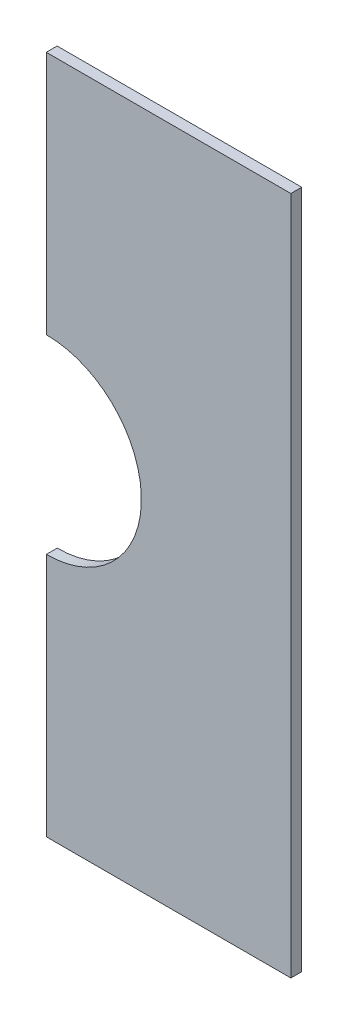
ISO-10303-21;
HEADER;
FILE_DESCRIPTION(('STEP AP214'),'2;1');
FILE_NAME('part.step','',(''),(''),'','','');
FILE_SCHEMA(('AUTOMOTIVE_DESIGN { 1 0 10303 214 1 1 1 1 }'));
ENDSEC;
DATA;
#1=APPLICATION_CONTEXT('core data for automotive mechanical design processes');
#2=APPLICATION_PROTOCOL_DEFINITION('international standard','automotive_design',2000,#1);
#3=PRODUCT_CONTEXT('',#1,'mechanical');
#4=PRODUCT('Part','Part','',(#3));
#5=PRODUCT_RELATED_PRODUCT_CATEGORY('part','',(#4));
#6=PRODUCT_DEFINITION_FORMATION('','',#4);
#7=PRODUCT_DEFINITION_CONTEXT('part definition',#1,'design');
#8=PRODUCT_DEFINITION('design','',#6,#7);
#9=PRODUCT_DEFINITION_SHAPE('','',#8);
#10=(LENGTH_UNIT() NAMED_UNIT(*) SI_UNIT(.MILLI.,.METRE.));
#11=(NAMED_UNIT(*) PLANE_ANGLE_UNIT() SI_UNIT($,.RADIAN.));
#12=(NAMED_UNIT(*) SI_UNIT($,.STERADIAN.) SOLID_ANGLE_UNIT());
#13=UNCERTAINTY_MEASURE_WITH_UNIT(LENGTH_MEASURE(1.E-05),#10,'distance_accuracy_value','');
#14=(GEOMETRIC_REPRESENTATION_CONTEXT(3) GLOBAL_UNCERTAINTY_ASSIGNED_CONTEXT((#13)) GLOBAL_UNIT_ASSIGNED_CONTEXT((#10,
#11,#12)) REPRESENTATION_CONTEXT('',''));
#15=CARTESIAN_POINT('',(0.,0.,0.));
#16=DIRECTION('',(0.,0.,1.));
#17=DIRECTION('',(1.,0.,0.));
#18=AXIS2_PLACEMENT_3D('',#15,#16,#17);
#19=CARTESIAN_POINT('',(-0.55,0.,0.3));
#20=DIRECTION('',(1.,0.,0.));
#21=DIRECTION('',(0.,1.,0.));
#22=AXIS2_PLACEMENT_3D('',#19,#20,#21);
#23=PLANE('',#22);
#24=DIRECTION('',(0.,-1.,0.));
#25=VECTOR('',#24,1.);
#26=CARTESIAN_POINT('',(-0.55,0.,0.28));
#27=LINE('',#26,#25);
#28=CARTESIAN_POINT('',(-0.55,0.625,0.28));
#29=VERTEX_POINT('',#28);
#30=CARTESIAN_POINT('',(-0.55,-0.625,0.28));
#31=VERTEX_POINT('',#30);
#32=EDGE_CURVE('E40',#29,#31,#27,.T.);
#33=ORIENTED_EDGE('',*,*,#32,.F.);
#34=DIRECTION('',(0.,0.,-1.));
#35=VECTOR('',#34,1.);
#36=CARTESIAN_POINT('',(-0.55,0.625,0.3));
#37=LINE('',#36,#35);
#38=CARTESIAN_POINT('',(-0.55,0.625,0.3));
#39=VERTEX_POINT('',#38);
#40=EDGE_CURVE('E48',#39,#29,#37,.T.);
#41=ORIENTED_EDGE('',*,*,#40,.F.);
#42=DIRECTION('',(0.,-1.,0.));
#43=VECTOR('',#42,1.);
#44=CARTESIAN_POINT('',(-0.55,0.,0.3));
#45=LINE('',#44,#43);
#46=CARTESIAN_POINT('',(-0.55,-0.625,0.3));
#47=VERTEX_POINT('',#46);
#48=EDGE_CURVE('E11',#39,#47,#45,.T.);
#49=ORIENTED_EDGE('',*,*,#48,.T.);
#50=DIRECTION('',(0.,0.,-1.));
#51=VECTOR('',#50,1.);
#52=CARTESIAN_POINT('',(-0.55,-0.625,0.3));
#53=LINE('',#52,#51);
#54=EDGE_CURVE('E27',#47,#31,#53,.T.);
#55=ORIENTED_EDGE('',*,*,#54,.T.);
#56=EDGE_LOOP('',(#33,#41,#49,#55));
#57=FACE_BOUND('',#56,.T.);
#58=ADVANCED_FACE('F17',(#57),#23,.T.);
#59=CARTESIAN_POINT('',(-0.775,0.625,0.3));
#60=DIRECTION('',(0.,-1.,0.));
#61=DIRECTION('',(0.,0.,-1.));
#62=AXIS2_PLACEMENT_3D('',#59,#60,#61);
#63=PLANE('',#62);
#64=DIRECTION('',(-1.,0.,0.));
#65=VECTOR('',#64,1.);
#66=CARTESIAN_POINT('',(-0.775,0.625,0.28));
#67=LINE('',#66,#65);
#68=CARTESIAN_POINT('',(-1.,0.625,0.28));
#69=VERTEX_POINT('',#68);
#70=EDGE_CURVE('E138',#29,#69,#67,.T.);
#71=ORIENTED_EDGE('',*,*,#70,.T.);
#72=DIRECTION('',(0.,0.,-1.));
#73=VECTOR('',#72,1.);
#74=CARTESIAN_POINT('',(-1.,0.625,0.3));
#75=LINE('',#74,#73);
#76=CARTESIAN_POINT('',(-1.,0.625,0.3));
#77=VERTEX_POINT('',#76);
#78=EDGE_CURVE('E135',#77,#69,#75,.T.);
#79=ORIENTED_EDGE('',*,*,#78,.F.);
#80=DIRECTION('',(-1.,0.,0.));
#81=VECTOR('',#80,1.);
#82=CARTESIAN_POINT('',(-0.775,0.625,0.3));
#83=LINE('',#82,#81);
#84=EDGE_CURVE('E150',#39,#77,#83,.T.);
#85=ORIENTED_EDGE('',*,*,#84,.F.);
#86=ORIENTED_EDGE('',*,*,#40,.T.);
#87=EDGE_LOOP('',(#71,#79,#85,#86));
#88=FACE_BOUND('',#87,.T.);
#89=ADVANCED_FACE('F211',(#88),#63,.F.);
#90=CARTESIAN_POINT('',(-1.,0.4,0.3));
#91=DIRECTION('',(1.,0.,0.));
#92=DIRECTION('',(0.,1.,0.));
#93=AXIS2_PLACEMENT_3D('',#90,#91,#92);
#94=PLANE('',#93);
#95=DIRECTION('',(0.,-1.,0.));
#96=VECTOR('',#95,1.);
#97=CARTESIAN_POINT('',(-1.,0.4,0.28));
#98=LINE('',#97,#96);
#99=CARTESIAN_POINT('',(-1.,0.175,0.28));
#100=VERTEX_POINT('',#99);
#101=EDGE_CURVE('E132',#69,#100,#98,.T.);
#102=ORIENTED_EDGE('',*,*,#101,.T.);
#103=DIRECTION('',(0.,0.,-1.));
#104=VECTOR('',#103,1.);
#105=CARTESIAN_POINT('',(-1.,0.175,0.3));
#106=LINE('',#105,#104);
#107=CARTESIAN_POINT('',(-1.,0.175,0.3));
#108=VERTEX_POINT('',#107);
#109=EDGE_CURVE('E107',#108,#100,#106,.T.);
#110=ORIENTED_EDGE('',*,*,#109,.F.);
#111=DIRECTION('',(0.,-1.,0.));
#112=VECTOR('',#111,1.);
#113=CARTESIAN_POINT('',(-1.,0.4,0.3));
#114=LINE('',#113,#112);
#115=EDGE_CURVE('E145',#77,#108,#114,.T.);
#116=ORIENTED_EDGE('',*,*,#115,.F.);
#117=ORIENTED_EDGE('',*,*,#78,.T.);
#118=EDGE_LOOP('',(#102,#110,#116,#117));
#119=FACE_BOUND('',#118,.T.);
#120=ADVANCED_FACE('F216',(#119),#94,.F.);
#121=CARTESIAN_POINT('',(-1.,0.,0.3));
#122=DIRECTION('',(0.,0.,-1.));
#123=DIRECTION('',(1.,0.,0.));
#124=AXIS2_PLACEMENT_3D('',#121,#122,#123);
#125=CYLINDRICAL_SURFACE('',#124,0.175);
#126=CARTESIAN_POINT('',(-1.,0.,0.28));
#127=DIRECTION('',(0.,0.,1.));
#128=DIRECTION('',(1.,0.,0.));
#129=AXIS2_PLACEMENT_3D('',#126,#127,#128);
#130=CIRCLE('',#129,0.175);
#131=CARTESIAN_POINT('',(-1.,-0.175,0.28));
#132=VERTEX_POINT('',#131);
#133=EDGE_CURVE('E104',#132,#100,#130,.T.);
#134=ORIENTED_EDGE('',*,*,#133,.F.);
#135=DIRECTION('',(0.,0.,-1.));
#136=VECTOR('',#135,1.);
#137=CARTESIAN_POINT('',(-1.,-0.175,0.3));
#138=LINE('',#137,#136);
#139=CARTESIAN_POINT('',(-1.,-0.175,0.3));
#140=VERTEX_POINT('',#139);
#141=EDGE_CURVE('E101',#140,#132,#138,.T.);
#142=ORIENTED_EDGE('',*,*,#141,.F.);
#143=CARTESIAN_POINT('',(-1.,0.,0.3));
#144=DIRECTION('',(0.,0.,1.));
#145=DIRECTION('',(1.,0.,0.));
#146=AXIS2_PLACEMENT_3D('',#143,#144,#145);
#147=CIRCLE('',#146,0.175);
#148=EDGE_CURVE('E128',#140,#108,#147,.T.);
#149=ORIENTED_EDGE('',*,*,#148,.T.);
#150=ORIENTED_EDGE('',*,*,#109,.T.);
#151=EDGE_LOOP('',(#134,#142,#149,#150));
#152=FACE_BOUND('',#151,.T.);
#153=ADVANCED_FACE('F105',(#152),#125,.F.);
#154=CARTESIAN_POINT('',(-1.,-0.4,0.3));
#155=DIRECTION('',(1.,0.,0.));
#156=DIRECTION('',(0.,1.,0.));
#157=AXIS2_PLACEMENT_3D('',#154,#155,#156);
#158=PLANE('',#157);
#159=DIRECTION('',(0.,-1.,0.));
#160=VECTOR('',#159,1.);
#161=CARTESIAN_POINT('',(-1.,-0.4,0.28));
#162=LINE('',#161,#160);
#163=CARTESIAN_POINT('',(-1.,-0.625,0.28));
#164=VERTEX_POINT('',#163);
#165=EDGE_CURVE('E116',#132,#164,#162,.T.);
#166=ORIENTED_EDGE('',*,*,#165,.T.);
#167=DIRECTION('',(0.,0.,-1.));
#168=VECTOR('',#167,1.);
#169=CARTESIAN_POINT('',(-1.,-0.625,0.3));
#170=LINE('',#169,#168);
#171=CARTESIAN_POINT('',(-1.,-0.625,0.3));
#172=VERTEX_POINT('',#171);
#173=EDGE_CURVE('E92',#172,#164,#170,.T.);
#174=ORIENTED_EDGE('',*,*,#173,.F.);
#175=DIRECTION('',(0.,-1.,0.));
#176=VECTOR('',#175,1.);
#177=CARTESIAN_POINT('',(-1.,-0.4,0.3));
#178=LINE('',#177,#176);
#179=EDGE_CURVE('E82',#140,#172,#178,.T.);
#180=ORIENTED_EDGE('',*,*,#179,.F.);
#181=ORIENTED_EDGE('',*,*,#141,.T.);
#182=EDGE_LOOP('',(#166,#174,#180,#181));
#183=FACE_BOUND('',#182,.T.);
#184=ADVANCED_FACE('F115',(#183),#158,.F.);
#185=CARTESIAN_POINT('',(-0.775,-0.625,0.3));
#186=DIRECTION('',(0.,-1.,0.));
#187=DIRECTION('',(0.,0.,-1.));
#188=AXIS2_PLACEMENT_3D('',#185,#186,#187);
#189=PLANE('',#188);
#190=DIRECTION('',(-1.,0.,0.));
#191=VECTOR('',#190,1.);
#192=CARTESIAN_POINT('',(-0.775,-0.625,0.28));
#193=LINE('',#192,#191);
#194=EDGE_CURVE('E21',#31,#164,#193,.T.);
#195=ORIENTED_EDGE('',*,*,#194,.F.);
#196=ORIENTED_EDGE('',*,*,#54,.F.);
#197=DIRECTION('',(-1.,0.,0.));
#198=VECTOR('',#197,1.);
#199=CARTESIAN_POINT('',(-0.775,-0.625,0.3));
#200=LINE('',#199,#198);
#201=EDGE_CURVE('E119',#47,#172,#200,.T.);
#202=ORIENTED_EDGE('',*,*,#201,.T.);
#203=ORIENTED_EDGE('',*,*,#173,.T.);
#204=EDGE_LOOP('',(#195,#196,#202,#203));
#205=FACE_BOUND('',#204,.T.);
#206=ADVANCED_FACE('F227',(#205),#189,.T.);
#207=CARTESIAN_POINT('',(0.,0.,0.3));
#208=DIRECTION('',(0.,0.,1.));
#209=DIRECTION('',(1.,0.,0.));
#210=AXIS2_PLACEMENT_3D('',#207,#208,#209);
#211=PLANE('',#210);
#212=ORIENTED_EDGE('',*,*,#48,.F.);
#213=ORIENTED_EDGE('',*,*,#84,.T.);
#214=ORIENTED_EDGE('',*,*,#115,.T.);
#215=ORIENTED_EDGE('',*,*,#148,.F.);
#216=ORIENTED_EDGE('',*,*,#179,.T.);
#217=ORIENTED_EDGE('',*,*,#201,.F.);
#218=EDGE_LOOP('',(#212,#213,#214,#215,#216,#217));
#219=FACE_BOUND('',#218,.T.);
#220=ADVANCED_FACE('F19',(#219),#211,.T.);
#221=CARTESIAN_POINT('',(0.,0.,0.28));
#222=DIRECTION('',(0.,0.,1.));
#223=DIRECTION('',(1.,0.,0.));
#224=AXIS2_PLACEMENT_3D('',#221,#222,#223);
#225=PLANE('',#224);
#226=ORIENTED_EDGE('',*,*,#32,.T.);
#227=ORIENTED_EDGE('',*,*,#194,.T.);
#228=ORIENTED_EDGE('',*,*,#165,.F.);
#229=ORIENTED_EDGE('',*,*,#133,.T.);
#230=ORIENTED_EDGE('',*,*,#101,.F.);
#231=ORIENTED_EDGE('',*,*,#70,.F.);
#232=EDGE_LOOP('',(#226,#227,#228,#229,#230,#231));
#233=FACE_BOUND('',#232,.T.);
#234=ADVANCED_FACE('F121',(#233),#225,.F.);
#235=CLOSED_SHELL('',(#58,#89,#120,#153,#184,#206,#220,#234));
#236=MANIFOLD_SOLID_BREP('B1',#235);
#237=ADVANCED_BREP_SHAPE_REPRESENTATION('',(#18,#236),#14);
#238=SHAPE_DEFINITION_REPRESENTATION(#9,#237);
ENDSEC;
END-ISO-10303-21;
